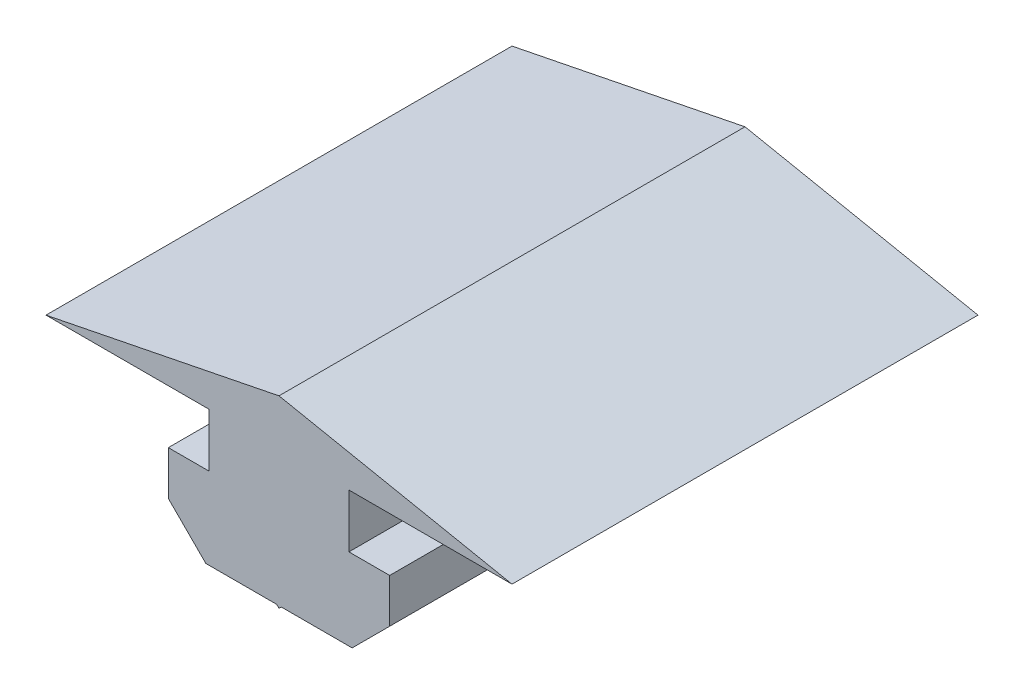
ISO-10303-21;
HEADER;
FILE_DESCRIPTION(('STEP AP214'),'2;1');
FILE_NAME('part.step','',(''),(''),'','','');
FILE_SCHEMA(('AUTOMOTIVE_DESIGN { 1 0 10303 214 1 1 1 1 }'));
ENDSEC;
DATA;
#1=APPLICATION_CONTEXT('core data for automotive mechanical design processes');
#2=APPLICATION_PROTOCOL_DEFINITION('international standard','automotive_design',2000,#1);
#3=PRODUCT_CONTEXT('',#1,'mechanical');
#4=PRODUCT('Part','Part','',(#3));
#5=PRODUCT_RELATED_PRODUCT_CATEGORY('part','',(#4));
#6=PRODUCT_DEFINITION_FORMATION('','',#4);
#7=PRODUCT_DEFINITION_CONTEXT('part definition',#1,'design');
#8=PRODUCT_DEFINITION('design','',#6,#7);
#9=PRODUCT_DEFINITION_SHAPE('','',#8);
#10=(LENGTH_UNIT() NAMED_UNIT(*) SI_UNIT(.MILLI.,.METRE.));
#11=(NAMED_UNIT(*) PLANE_ANGLE_UNIT() SI_UNIT($,.RADIAN.));
#12=(NAMED_UNIT(*) SI_UNIT($,.STERADIAN.) SOLID_ANGLE_UNIT());
#13=UNCERTAINTY_MEASURE_WITH_UNIT(LENGTH_MEASURE(1.E-05),#10,'distance_accuracy_value','');
#14=(GEOMETRIC_REPRESENTATION_CONTEXT(3) GLOBAL_UNCERTAINTY_ASSIGNED_CONTEXT((#13)) GLOBAL_UNIT_ASSIGNED_CONTEXT((#10,
#11,#12)) REPRESENTATION_CONTEXT('',''));
#15=CARTESIAN_POINT('',(0.,0.,0.));
#16=DIRECTION('',(0.,0.,1.));
#17=DIRECTION('',(1.,0.,0.));
#18=AXIS2_PLACEMENT_3D('',#15,#16,#17);
#19=CARTESIAN_POINT('',(3.,0.,20.));
#20=DIRECTION('',(1.,0.,0.));
#21=DIRECTION('',(0.,1.,0.));
#22=AXIS2_PLACEMENT_3D('',#19,#20,#21);
#23=PLANE('',#22);
#24=DIRECTION('',(0.,-1.,0.));
#25=VECTOR('',#24,1.);
#26=CARTESIAN_POINT('',(3.,0.,0.));
#27=LINE('',#26,#25);
#28=CARTESIAN_POINT('',(3.,0.,0.));
#29=VERTEX_POINT('',#28);
#30=CARTESIAN_POINT('',(3.,-2.29999999999999,0.));
#31=VERTEX_POINT('',#30);
#32=EDGE_CURVE('E176',#29,#31,#27,.T.);
#33=ORIENTED_EDGE('',*,*,#32,.F.);
#34=DIRECTION('',(0.,0.,-1.));
#35=VECTOR('',#34,1.);
#36=CARTESIAN_POINT('',(3.,0.,20.));
#37=LINE('',#36,#35);
#38=CARTESIAN_POINT('',(3.,0.,20.));
#39=VERTEX_POINT('',#38);
#40=EDGE_CURVE('E11',#39,#29,#37,.T.);
#41=ORIENTED_EDGE('',*,*,#40,.F.);
#42=DIRECTION('',(0.,-1.,0.));
#43=VECTOR('',#42,1.);
#44=CARTESIAN_POINT('',(3.,0.,20.));
#45=LINE('',#44,#43);
#46=CARTESIAN_POINT('',(3.,-2.29999999999999,20.));
#47=VERTEX_POINT('',#46);
#48=EDGE_CURVE('E216',#39,#47,#45,.T.);
#49=ORIENTED_EDGE('',*,*,#48,.T.);
#50=DIRECTION('',(0.,0.,-1.));
#51=VECTOR('',#50,1.);
#52=CARTESIAN_POINT('',(3.,-2.29999999999999,20.));
#53=LINE('',#52,#51);
#54=EDGE_CURVE('E50',#47,#31,#53,.T.);
#55=ORIENTED_EDGE('',*,*,#54,.T.);
#56=EDGE_LOOP('',(#33,#41,#49,#55));
#57=FACE_BOUND('',#56,.T.);
#58=ADVANCED_FACE('F34',(#57),#23,.T.);
#59=CARTESIAN_POINT('',(0.,0.,20.));
#60=DIRECTION('',(0.,1.,0.));
#61=DIRECTION('',(-1.,0.,0.));
#62=AXIS2_PLACEMENT_3D('',#59,#60,#61);
#63=PLANE('',#62);
#64=DIRECTION('',(1.,0.,0.));
#65=VECTOR('',#64,1.);
#66=CARTESIAN_POINT('',(0.,0.,0.));
#67=LINE('',#66,#65);
#68=CARTESIAN_POINT('',(10.,0.,0.));
#69=VERTEX_POINT('',#68);
#70=EDGE_CURVE('E178',#29,#69,#67,.T.);
#71=ORIENTED_EDGE('',*,*,#70,.T.);
#72=DIRECTION('',(0.,0.,-1.));
#73=VECTOR('',#72,1.);
#74=CARTESIAN_POINT('',(10.,0.,20.));
#75=LINE('',#74,#73);
#76=CARTESIAN_POINT('',(10.,0.,20.));
#77=VERTEX_POINT('',#76);
#78=EDGE_CURVE('E42',#77,#69,#75,.T.);
#79=ORIENTED_EDGE('',*,*,#78,.F.);
#80=DIRECTION('',(1.,0.,0.));
#81=VECTOR('',#80,1.);
#82=CARTESIAN_POINT('',(0.,0.,20.));
#83=LINE('',#82,#81);
#84=EDGE_CURVE('E263',#39,#77,#83,.T.);
#85=ORIENTED_EDGE('',*,*,#84,.F.);
#86=ORIENTED_EDGE('',*,*,#40,.T.);
#87=EDGE_LOOP('',(#71,#79,#85,#86));
#88=FACE_BOUND('',#87,.T.);
#89=ADVANCED_FACE('F251',(#88),#63,.F.);
#90=CARTESIAN_POINT('',(0.384615384615384,1.92307692307692,20.));
#91=DIRECTION('',(0.196116135138184,0.98058067569092,0.));
#92=DIRECTION('',(-0.98058067569092,0.196116135138184,0.));
#93=AXIS2_PLACEMENT_3D('',#90,#91,#92);
#94=PLANE('',#93);
#95=DIRECTION('',(0.98058067569092,-0.196116135138184,0.));
#96=VECTOR('',#95,1.);
#97=CARTESIAN_POINT('',(0.384615384615384,1.92307692307692,0.));
#98=LINE('',#97,#96);
#99=CARTESIAN_POINT('',(0.,2.,0.));
#100=VERTEX_POINT('',#99);
#101=EDGE_CURVE('E181',#100,#69,#98,.T.);
#102=ORIENTED_EDGE('',*,*,#101,.F.);
#103=DIRECTION('',(0.,0.,-1.));
#104=VECTOR('',#103,1.);
#105=CARTESIAN_POINT('',(0.,2.,20.));
#106=LINE('',#105,#104);
#107=CARTESIAN_POINT('',(0.,2.,20.));
#108=VERTEX_POINT('',#107);
#109=EDGE_CURVE('E241',#108,#100,#106,.T.);
#110=ORIENTED_EDGE('',*,*,#109,.F.);
#111=DIRECTION('',(0.98058067569092,-0.196116135138184,0.));
#112=VECTOR('',#111,1.);
#113=CARTESIAN_POINT('',(0.384615384615384,1.92307692307692,20.));
#114=LINE('',#113,#112);
#115=EDGE_CURVE('E248',#108,#77,#114,.T.);
#116=ORIENTED_EDGE('',*,*,#115,.T.);
#117=ORIENTED_EDGE('',*,*,#78,.T.);
#118=EDGE_LOOP('',(#102,#110,#116,#117));
#119=FACE_BOUND('',#118,.T.);
#120=ADVANCED_FACE('F246',(#119),#94,.T.);
#121=CARTESIAN_POINT('',(-0.384615384615385,1.92307692307692,20.));
#122=DIRECTION('',(-0.196116135138184,0.98058067569092,0.));
#123=DIRECTION('',(-0.98058067569092,-0.196116135138184,0.));
#124=AXIS2_PLACEMENT_3D('',#121,#122,#123);
#125=PLANE('',#124);
#126=DIRECTION('',(0.98058067569092,0.196116135138184,0.));
#127=VECTOR('',#126,1.);
#128=CARTESIAN_POINT('',(-0.384615384615385,1.92307692307692,0.));
#129=LINE('',#128,#127);
#130=CARTESIAN_POINT('',(-10.,0.,0.));
#131=VERTEX_POINT('',#130);
#132=EDGE_CURVE('E184',#131,#100,#129,.T.);
#133=ORIENTED_EDGE('',*,*,#132,.F.);
#134=DIRECTION('',(0.,0.,-1.));
#135=VECTOR('',#134,1.);
#136=CARTESIAN_POINT('',(-10.,0.,20.));
#137=LINE('',#136,#135);
#138=CARTESIAN_POINT('',(-10.,0.,20.));
#139=VERTEX_POINT('',#138);
#140=EDGE_CURVE('E239',#139,#131,#137,.T.);
#141=ORIENTED_EDGE('',*,*,#140,.F.);
#142=DIRECTION('',(0.98058067569092,0.196116135138184,0.));
#143=VECTOR('',#142,1.);
#144=CARTESIAN_POINT('',(-0.384615384615385,1.92307692307692,20.));
#145=LINE('',#144,#143);
#146=EDGE_CURVE('E262',#139,#108,#145,.T.);
#147=ORIENTED_EDGE('',*,*,#146,.T.);
#148=ORIENTED_EDGE('',*,*,#109,.T.);
#149=EDGE_LOOP('',(#133,#141,#147,#148));
#150=FACE_BOUND('',#149,.T.);
#151=ADVANCED_FACE('F258',(#150),#125,.T.);
#152=CARTESIAN_POINT('',(0.,0.,20.));
#153=DIRECTION('',(0.,1.,0.));
#154=DIRECTION('',(-1.,0.,0.));
#155=AXIS2_PLACEMENT_3D('',#152,#153,#154);
#156=PLANE('',#155);
#157=DIRECTION('',(1.,0.,0.));
#158=VECTOR('',#157,1.);
#159=CARTESIAN_POINT('',(0.,0.,0.));
#160=LINE('',#159,#158);
#161=CARTESIAN_POINT('',(-3.,0.,0.));
#162=VERTEX_POINT('',#161);
#163=EDGE_CURVE('E187',#131,#162,#160,.T.);
#164=ORIENTED_EDGE('',*,*,#163,.T.);
#165=DIRECTION('',(0.,0.,-1.));
#166=VECTOR('',#165,1.);
#167=CARTESIAN_POINT('',(-3.,0.,20.));
#168=LINE('',#167,#166);
#169=CARTESIAN_POINT('',(-3.,0.,20.));
#170=VERTEX_POINT('',#169);
#171=EDGE_CURVE('E236',#170,#162,#168,.T.);
#172=ORIENTED_EDGE('',*,*,#171,.F.);
#173=DIRECTION('',(1.,0.,0.));
#174=VECTOR('',#173,1.);
#175=CARTESIAN_POINT('',(0.,0.,20.));
#176=LINE('',#175,#174);
#177=EDGE_CURVE('E265',#139,#170,#176,.T.);
#178=ORIENTED_EDGE('',*,*,#177,.F.);
#179=ORIENTED_EDGE('',*,*,#140,.T.);
#180=EDGE_LOOP('',(#164,#172,#178,#179));
#181=FACE_BOUND('',#180,.T.);
#182=ADVANCED_FACE('F319',(#181),#156,.F.);
#183=CARTESIAN_POINT('',(-3.,0.,20.));
#184=DIRECTION('',(1.,0.,0.));
#185=DIRECTION('',(0.,1.,0.));
#186=AXIS2_PLACEMENT_3D('',#183,#184,#185);
#187=PLANE('',#186);
#188=DIRECTION('',(0.,-1.,0.));
#189=VECTOR('',#188,1.);
#190=CARTESIAN_POINT('',(-3.,0.,0.));
#191=LINE('',#190,#189);
#192=CARTESIAN_POINT('',(-3.,-2.29999999999999,0.));
#193=VERTEX_POINT('',#192);
#194=EDGE_CURVE('E189',#162,#193,#191,.T.);
#195=ORIENTED_EDGE('',*,*,#194,.T.);
#196=DIRECTION('',(0.,0.,-1.));
#197=VECTOR('',#196,1.);
#198=CARTESIAN_POINT('',(-3.,-2.29999999999999,20.));
#199=LINE('',#198,#197);
#200=CARTESIAN_POINT('',(-3.,-2.29999999999999,20.));
#201=VERTEX_POINT('',#200);
#202=EDGE_CURVE('E233',#201,#193,#199,.T.);
#203=ORIENTED_EDGE('',*,*,#202,.F.);
#204=DIRECTION('',(0.,-1.,0.));
#205=VECTOR('',#204,1.);
#206=CARTESIAN_POINT('',(-3.,0.,20.));
#207=LINE('',#206,#205);
#208=EDGE_CURVE('E271',#170,#201,#207,.T.);
#209=ORIENTED_EDGE('',*,*,#208,.F.);
#210=ORIENTED_EDGE('',*,*,#171,.T.);
#211=EDGE_LOOP('',(#195,#203,#209,#210));
#212=FACE_BOUND('',#211,.T.);
#213=ADVANCED_FACE('F322',(#212),#187,.F.);
#214=CARTESIAN_POINT('',(0.,-2.29999999999999,20.));
#215=DIRECTION('',(0.,-1.,0.));
#216=DIRECTION('',(0.,0.,-1.));
#217=AXIS2_PLACEMENT_3D('',#214,#215,#216);
#218=PLANE('',#217);
#219=DIRECTION('',(-1.,0.,0.));
#220=VECTOR('',#219,1.);
#221=CARTESIAN_POINT('',(0.,-2.29999999999999,0.));
#222=LINE('',#221,#220);
#223=CARTESIAN_POINT('',(-4.75,-2.29999999999999,0.));
#224=VERTEX_POINT('',#223);
#225=EDGE_CURVE('E191',#193,#224,#222,.T.);
#226=ORIENTED_EDGE('',*,*,#225,.T.);
#227=DIRECTION('',(0.,0.,-1.));
#228=VECTOR('',#227,1.);
#229=CARTESIAN_POINT('',(-4.75,-2.29999999999999,20.));
#230=LINE('',#229,#228);
#231=CARTESIAN_POINT('',(-4.75,-2.29999999999999,20.));
#232=VERTEX_POINT('',#231);
#233=EDGE_CURVE('E231',#232,#224,#230,.T.);
#234=ORIENTED_EDGE('',*,*,#233,.F.);
#235=DIRECTION('',(-1.,0.,0.));
#236=VECTOR('',#235,1.);
#237=CARTESIAN_POINT('',(0.,-2.29999999999999,20.));
#238=LINE('',#237,#236);
#239=EDGE_CURVE('E273',#201,#232,#238,.T.);
#240=ORIENTED_EDGE('',*,*,#239,.F.);
#241=ORIENTED_EDGE('',*,*,#202,.T.);
#242=EDGE_LOOP('',(#226,#234,#240,#241));
#243=FACE_BOUND('',#242,.T.);
#244=ADVANCED_FACE('F326',(#243),#218,.F.);
#245=CARTESIAN_POINT('',(-4.75,0.,20.));
#246=DIRECTION('',(-1.,0.,0.));
#247=DIRECTION('',(0.,0.,1.));
#248=AXIS2_PLACEMENT_3D('',#245,#246,#247);
#249=PLANE('',#248);
#250=DIRECTION('',(0.,1.,0.));
#251=VECTOR('',#250,1.);
#252=CARTESIAN_POINT('',(-4.75,0.,0.));
#253=LINE('',#252,#251);
#254=CARTESIAN_POINT('',(-4.75,-4.18933982822024,0.));
#255=VERTEX_POINT('',#254);
#256=EDGE_CURVE('E194',#255,#224,#253,.T.);
#257=ORIENTED_EDGE('',*,*,#256,.F.);
#258=DIRECTION('',(0.,0.,-1.));
#259=VECTOR('',#258,1.);
#260=CARTESIAN_POINT('',(-4.75,-4.18933982822024,20.));
#261=LINE('',#260,#259);
#262=CARTESIAN_POINT('',(-4.75,-4.18933982822024,20.));
#263=VERTEX_POINT('',#262);
#264=EDGE_CURVE('E229',#263,#255,#261,.T.);
#265=ORIENTED_EDGE('',*,*,#264,.F.);
#266=DIRECTION('',(0.,1.,0.));
#267=VECTOR('',#266,1.);
#268=CARTESIAN_POINT('',(-4.75,0.,20.));
#269=LINE('',#268,#267);
#270=EDGE_CURVE('E275',#263,#232,#269,.T.);
#271=ORIENTED_EDGE('',*,*,#270,.T.);
#272=ORIENTED_EDGE('',*,*,#233,.T.);
#273=EDGE_LOOP('',(#257,#265,#271,#272));
#274=FACE_BOUND('',#273,.T.);
#275=ADVANCED_FACE('F330',(#274),#249,.T.);
#276=CARTESIAN_POINT('',(-4.46966991411009,-4.46966991411014,20.));
#277=DIRECTION('',(-0.707106781186544,-0.707106781186552,0.));
#278=DIRECTION('',(0.707106781186551,-0.707106781186544,0.));
#279=AXIS2_PLACEMENT_3D('',#276,#277,#278);
#280=PLANE('',#279);
#281=DIRECTION('',(-0.707106781186552,0.707106781186544,0.));
#282=VECTOR('',#281,1.);
#283=CARTESIAN_POINT('',(-4.46966991411009,-4.46966991411014,0.));
#284=LINE('',#283,#282);
#285=CARTESIAN_POINT('',(-3.13933982822022,-5.8,0.));
#286=VERTEX_POINT('',#285);
#287=EDGE_CURVE('E197',#286,#255,#284,.T.);
#288=ORIENTED_EDGE('',*,*,#287,.F.);
#289=DIRECTION('',(0.,0.,-1.));
#290=VECTOR('',#289,1.);
#291=CARTESIAN_POINT('',(-3.13933982822022,-5.8,20.));
#292=LINE('',#291,#290);
#293=CARTESIAN_POINT('',(-3.13933982822022,-5.8,20.));
#294=VERTEX_POINT('',#293);
#295=EDGE_CURVE('E227',#294,#286,#292,.T.);
#296=ORIENTED_EDGE('',*,*,#295,.F.);
#297=DIRECTION('',(-0.707106781186552,0.707106781186544,0.));
#298=VECTOR('',#297,1.);
#299=CARTESIAN_POINT('',(-4.46966991411009,-4.46966991411014,20.));
#300=LINE('',#299,#298);
#301=EDGE_CURVE('E278',#294,#263,#300,.T.);
#302=ORIENTED_EDGE('',*,*,#301,.T.);
#303=ORIENTED_EDGE('',*,*,#264,.T.);
#304=EDGE_LOOP('',(#288,#296,#302,#303));
#305=FACE_BOUND('',#304,.T.);
#306=ADVANCED_FACE('F334',(#305),#280,.T.);
#307=CARTESIAN_POINT('',(0.,-5.8,20.));
#308=DIRECTION('',(0.,-1.,0.));
#309=DIRECTION('',(0.,0.,-1.));
#310=AXIS2_PLACEMENT_3D('',#307,#308,#309);
#311=PLANE('',#310);
#312=DIRECTION('',(-1.,0.,0.));
#313=VECTOR('',#312,1.);
#314=CARTESIAN_POINT('',(0.,-5.8,0.));
#315=LINE('',#314,#313);
#316=CARTESIAN_POINT('',(-0.100000000000002,-5.8,0.));
#317=VERTEX_POINT('',#316);
#318=EDGE_CURVE('E200',#317,#286,#315,.T.);
#319=ORIENTED_EDGE('',*,*,#318,.F.);
#320=DIRECTION('',(0.,0.,-1.));
#321=VECTOR('',#320,1.);
#322=CARTESIAN_POINT('',(-0.100000000000002,-5.8,20.));
#323=LINE('',#322,#321);
#324=CARTESIAN_POINT('',(-0.100000000000002,-5.8,20.));
#325=VERTEX_POINT('',#324);
#326=EDGE_CURVE('E225',#325,#317,#323,.T.);
#327=ORIENTED_EDGE('',*,*,#326,.F.);
#328=DIRECTION('',(-1.,0.,0.));
#329=VECTOR('',#328,1.);
#330=CARTESIAN_POINT('',(0.,-5.8,20.));
#331=LINE('',#330,#329);
#332=EDGE_CURVE('E281',#325,#294,#331,.T.);
#333=ORIENTED_EDGE('',*,*,#332,.T.);
#334=ORIENTED_EDGE('',*,*,#295,.T.);
#335=EDGE_LOOP('',(#319,#327,#333,#334));
#336=FACE_BOUND('',#335,.T.);
#337=ADVANCED_FACE('F338',(#336),#311,.T.);
#338=CARTESIAN_POINT('',(-2.95,-2.95000000000006,20.));
#339=DIRECTION('',(-0.707106781186541,-0.707106781186555,0.));
#340=DIRECTION('',(0.707106781186555,-0.707106781186541,0.));
#341=AXIS2_PLACEMENT_3D('',#338,#339,#340);
#342=PLANE('',#341);
#343=DIRECTION('',(-0.707106781186555,0.707106781186541,0.));
#344=VECTOR('',#343,1.);
#345=CARTESIAN_POINT('',(-2.95,-2.95000000000006,0.));
#346=LINE('',#345,#344);
#347=CARTESIAN_POINT('',(0.,-5.9,0.));
#348=VERTEX_POINT('',#347);
#349=EDGE_CURVE('E203',#348,#317,#346,.T.);
#350=ORIENTED_EDGE('',*,*,#349,.F.);
#351=DIRECTION('',(0.,0.,-1.));
#352=VECTOR('',#351,1.);
#353=CARTESIAN_POINT('',(0.,-5.9,20.));
#354=LINE('',#353,#352);
#355=CARTESIAN_POINT('',(0.,-5.9,20.));
#356=VERTEX_POINT('',#355);
#357=EDGE_CURVE('E223',#356,#348,#354,.T.);
#358=ORIENTED_EDGE('',*,*,#357,.F.);
#359=DIRECTION('',(-0.707106781186555,0.707106781186541,0.));
#360=VECTOR('',#359,1.);
#361=CARTESIAN_POINT('',(-2.95,-2.95000000000006,20.));
#362=LINE('',#361,#360);
#363=EDGE_CURVE('E284',#356,#325,#362,.T.);
#364=ORIENTED_EDGE('',*,*,#363,.T.);
#365=ORIENTED_EDGE('',*,*,#326,.T.);
#366=EDGE_LOOP('',(#350,#358,#364,#365));
#367=FACE_BOUND('',#366,.T.);
#368=ADVANCED_FACE('F342',(#367),#342,.T.);
#369=CARTESIAN_POINT('',(2.95,-2.95000000000006,20.));
#370=DIRECTION('',(-0.707106781186541,0.707106781186555,0.));
#371=DIRECTION('',(-0.707106781186555,-0.707106781186541,0.));
#372=AXIS2_PLACEMENT_3D('',#369,#370,#371);
#373=PLANE('',#372);
#374=DIRECTION('',(0.707106781186555,0.707106781186541,0.));
#375=VECTOR('',#374,1.);
#376=CARTESIAN_POINT('',(2.95,-2.95000000000006,0.));
#377=LINE('',#376,#375);
#378=CARTESIAN_POINT('',(0.100000000000002,-5.8,0.));
#379=VERTEX_POINT('',#378);
#380=EDGE_CURVE('E206',#348,#379,#377,.T.);
#381=ORIENTED_EDGE('',*,*,#380,.T.);
#382=DIRECTION('',(0.,0.,-1.));
#383=VECTOR('',#382,1.);
#384=CARTESIAN_POINT('',(0.100000000000002,-5.8,20.));
#385=LINE('',#384,#383);
#386=CARTESIAN_POINT('',(0.100000000000002,-5.8,20.));
#387=VERTEX_POINT('',#386);
#388=EDGE_CURVE('E220',#387,#379,#385,.T.);
#389=ORIENTED_EDGE('',*,*,#388,.F.);
#390=DIRECTION('',(0.707106781186555,0.707106781186541,0.));
#391=VECTOR('',#390,1.);
#392=CARTESIAN_POINT('',(2.95,-2.95000000000006,20.));
#393=LINE('',#392,#391);
#394=EDGE_CURVE('E287',#356,#387,#393,.T.);
#395=ORIENTED_EDGE('',*,*,#394,.F.);
#396=ORIENTED_EDGE('',*,*,#357,.T.);
#397=EDGE_LOOP('',(#381,#389,#395,#396));
#398=FACE_BOUND('',#397,.T.);
#399=ADVANCED_FACE('F293',(#398),#373,.F.);
#400=CARTESIAN_POINT('',(0.,-5.8,20.));
#401=DIRECTION('',(0.,1.,0.));
#402=DIRECTION('',(0.,0.,1.));
#403=AXIS2_PLACEMENT_3D('',#400,#401,#402);
#404=PLANE('',#403);
#405=DIRECTION('',(1.,0.,0.));
#406=VECTOR('',#405,1.);
#407=CARTESIAN_POINT('',(0.,-5.8,0.));
#408=LINE('',#407,#406);
#409=CARTESIAN_POINT('',(3.13933982822022,-5.8,0.));
#410=VERTEX_POINT('',#409);
#411=EDGE_CURVE('E208',#379,#410,#408,.T.);
#412=ORIENTED_EDGE('',*,*,#411,.T.);
#413=DIRECTION('',(0.,0.,-1.));
#414=VECTOR('',#413,1.);
#415=CARTESIAN_POINT('',(3.13933982822022,-5.8,20.));
#416=LINE('',#415,#414);
#417=CARTESIAN_POINT('',(3.13933982822022,-5.8,20.));
#418=VERTEX_POINT('',#417);
#419=EDGE_CURVE('E168',#418,#410,#416,.T.);
#420=ORIENTED_EDGE('',*,*,#419,.F.);
#421=DIRECTION('',(1.,0.,0.));
#422=VECTOR('',#421,1.);
#423=CARTESIAN_POINT('',(0.,-5.8,20.));
#424=LINE('',#423,#422);
#425=EDGE_CURVE('E156',#387,#418,#424,.T.);
#426=ORIENTED_EDGE('',*,*,#425,.F.);
#427=ORIENTED_EDGE('',*,*,#388,.T.);
#428=EDGE_LOOP('',(#412,#420,#426,#427));
#429=FACE_BOUND('',#428,.T.);
#430=ADVANCED_FACE('F297',(#429),#404,.F.);
#431=CARTESIAN_POINT('',(4.46966991411009,-4.46966991411015,20.));
#432=DIRECTION('',(-0.707106781186543,0.707106781186552,0.));
#433=DIRECTION('',(-0.707106781186552,-0.707106781186543,0.));
#434=AXIS2_PLACEMENT_3D('',#431,#432,#433);
#435=PLANE('',#434);
#436=DIRECTION('',(0.707106781186552,0.707106781186543,0.));
#437=VECTOR('',#436,1.);
#438=CARTESIAN_POINT('',(4.46966991411009,-4.46966991411015,0.));
#439=LINE('',#438,#437);
#440=CARTESIAN_POINT('',(4.75,-4.18933982822024,0.));
#441=VERTEX_POINT('',#440);
#442=EDGE_CURVE('E165',#410,#441,#439,.T.);
#443=ORIENTED_EDGE('',*,*,#442,.T.);
#444=DIRECTION('',(0.,0.,-1.));
#445=VECTOR('',#444,1.);
#446=CARTESIAN_POINT('',(4.75,-4.18933982822024,20.));
#447=LINE('',#446,#445);
#448=CARTESIAN_POINT('',(4.75,-4.18933982822024,20.));
#449=VERTEX_POINT('',#448);
#450=EDGE_CURVE('E162',#449,#441,#447,.T.);
#451=ORIENTED_EDGE('',*,*,#450,.F.);
#452=DIRECTION('',(0.707106781186552,0.707106781186543,0.));
#453=VECTOR('',#452,1.);
#454=CARTESIAN_POINT('',(4.46966991411009,-4.46966991411015,20.));
#455=LINE('',#454,#453);
#456=EDGE_CURVE('E148',#418,#449,#455,.T.);
#457=ORIENTED_EDGE('',*,*,#456,.F.);
#458=ORIENTED_EDGE('',*,*,#419,.T.);
#459=EDGE_LOOP('',(#443,#451,#457,#458));
#460=FACE_BOUND('',#459,.T.);
#461=ADVANCED_FACE('F163',(#460),#435,.F.);
#462=CARTESIAN_POINT('',(4.75,0.,20.));
#463=DIRECTION('',(-1.,0.,0.));
#464=DIRECTION('',(0.,0.,1.));
#465=AXIS2_PLACEMENT_3D('',#462,#463,#464);
#466=PLANE('',#465);
#467=DIRECTION('',(0.,1.,0.));
#468=VECTOR('',#467,1.);
#469=CARTESIAN_POINT('',(4.75,0.,0.));
#470=LINE('',#469,#468);
#471=CARTESIAN_POINT('',(4.75,-2.29999999999999,0.));
#472=VERTEX_POINT('',#471);
#473=EDGE_CURVE('E211',#441,#472,#470,.T.);
#474=ORIENTED_EDGE('',*,*,#473,.T.);
#475=DIRECTION('',(0.,0.,-1.));
#476=VECTOR('',#475,1.);
#477=CARTESIAN_POINT('',(4.75,-2.29999999999999,20.));
#478=LINE('',#477,#476);
#479=CARTESIAN_POINT('',(4.75,-2.29999999999999,20.));
#480=VERTEX_POINT('',#479);
#481=EDGE_CURVE('E100',#480,#472,#478,.T.);
#482=ORIENTED_EDGE('',*,*,#481,.F.);
#483=DIRECTION('',(0.,1.,0.));
#484=VECTOR('',#483,1.);
#485=CARTESIAN_POINT('',(4.75,0.,20.));
#486=LINE('',#485,#484);
#487=EDGE_CURVE('E154',#449,#480,#486,.T.);
#488=ORIENTED_EDGE('',*,*,#487,.F.);
#489=ORIENTED_EDGE('',*,*,#450,.T.);
#490=EDGE_LOOP('',(#474,#482,#488,#489));
#491=FACE_BOUND('',#490,.T.);
#492=ADVANCED_FACE('F170',(#491),#466,.F.);
#493=CARTESIAN_POINT('',(0.,-2.29999999999999,20.));
#494=DIRECTION('',(0.,1.,0.));
#495=DIRECTION('',(0.,0.,1.));
#496=AXIS2_PLACEMENT_3D('',#493,#494,#495);
#497=PLANE('',#496);
#498=DIRECTION('',(1.,0.,0.));
#499=VECTOR('',#498,1.);
#500=CARTESIAN_POINT('',(0.,-2.29999999999999,0.));
#501=LINE('',#500,#499);
#502=EDGE_CURVE('E213',#31,#472,#501,.T.);
#503=ORIENTED_EDGE('',*,*,#502,.F.);
#504=ORIENTED_EDGE('',*,*,#54,.F.);
#505=DIRECTION('',(1.,0.,0.));
#506=VECTOR('',#505,1.);
#507=CARTESIAN_POINT('',(0.,-2.29999999999999,20.));
#508=LINE('',#507,#506);
#509=EDGE_CURVE('E171',#47,#480,#508,.T.);
#510=ORIENTED_EDGE('',*,*,#509,.T.);
#511=ORIENTED_EDGE('',*,*,#481,.T.);
#512=EDGE_LOOP('',(#503,#504,#510,#511));
#513=FACE_BOUND('',#512,.T.);
#514=ADVANCED_FACE('F298',(#513),#497,.T.);
#515=CARTESIAN_POINT('',(0.,0.,20.));
#516=DIRECTION('',(0.,0.,1.));
#517=DIRECTION('',(1.,0.,0.));
#518=AXIS2_PLACEMENT_3D('',#515,#516,#517);
#519=PLANE('',#518);
#520=ORIENTED_EDGE('',*,*,#48,.F.);
#521=ORIENTED_EDGE('',*,*,#84,.T.);
#522=ORIENTED_EDGE('',*,*,#115,.F.);
#523=ORIENTED_EDGE('',*,*,#146,.F.);
#524=ORIENTED_EDGE('',*,*,#177,.T.);
#525=ORIENTED_EDGE('',*,*,#208,.T.);
#526=ORIENTED_EDGE('',*,*,#239,.T.);
#527=ORIENTED_EDGE('',*,*,#270,.F.);
#528=ORIENTED_EDGE('',*,*,#301,.F.);
#529=ORIENTED_EDGE('',*,*,#332,.F.);
#530=ORIENTED_EDGE('',*,*,#363,.F.);
#531=ORIENTED_EDGE('',*,*,#394,.T.);
#532=ORIENTED_EDGE('',*,*,#425,.T.);
#533=ORIENTED_EDGE('',*,*,#456,.T.);
#534=ORIENTED_EDGE('',*,*,#487,.T.);
#535=ORIENTED_EDGE('',*,*,#509,.F.);
#536=EDGE_LOOP('',(#520,#521,#522,#523,#524,#525,#526,#527,#528,#529,#530,#531,#532,#533,#534,#535));
#537=FACE_BOUND('',#536,.T.);
#538=ADVANCED_FACE('F151',(#537),#519,.T.);
#539=CARTESIAN_POINT('',(0.,0.,0.));
#540=DIRECTION('',(0.,0.,1.));
#541=DIRECTION('',(1.,0.,0.));
#542=AXIS2_PLACEMENT_3D('',#539,#540,#541);
#543=PLANE('',#542);
#544=ORIENTED_EDGE('',*,*,#32,.T.);
#545=ORIENTED_EDGE('',*,*,#502,.T.);
#546=ORIENTED_EDGE('',*,*,#473,.F.);
#547=ORIENTED_EDGE('',*,*,#442,.F.);
#548=ORIENTED_EDGE('',*,*,#411,.F.);
#549=ORIENTED_EDGE('',*,*,#380,.F.);
#550=ORIENTED_EDGE('',*,*,#349,.T.);
#551=ORIENTED_EDGE('',*,*,#318,.T.);
#552=ORIENTED_EDGE('',*,*,#287,.T.);
#553=ORIENTED_EDGE('',*,*,#256,.T.);
#554=ORIENTED_EDGE('',*,*,#225,.F.);
#555=ORIENTED_EDGE('',*,*,#194,.F.);
#556=ORIENTED_EDGE('',*,*,#163,.F.);
#557=ORIENTED_EDGE('',*,*,#132,.T.);
#558=ORIENTED_EDGE('',*,*,#101,.T.);
#559=ORIENTED_EDGE('',*,*,#70,.F.);
#560=EDGE_LOOP('',(#544,#545,#546,#547,#548,#549,#550,#551,#552,#553,#554,#555,#556,#557,#558,#559));
#561=FACE_BOUND('',#560,.T.);
#562=ADVANCED_FACE('F253',(#561),#543,.F.);
#563=CLOSED_SHELL('',(#58,#89,#120,#151,#182,#213,#244,#275,#306,#337,#368,#399,#430,#461,#492,
#514,#538,#562));
#564=MANIFOLD_SOLID_BREP('B2',#563);
#565=ADVANCED_BREP_SHAPE_REPRESENTATION('',(#18,#564),#14);
#566=SHAPE_DEFINITION_REPRESENTATION(#9,#565);
ENDSEC;
END-ISO-10303-21;
